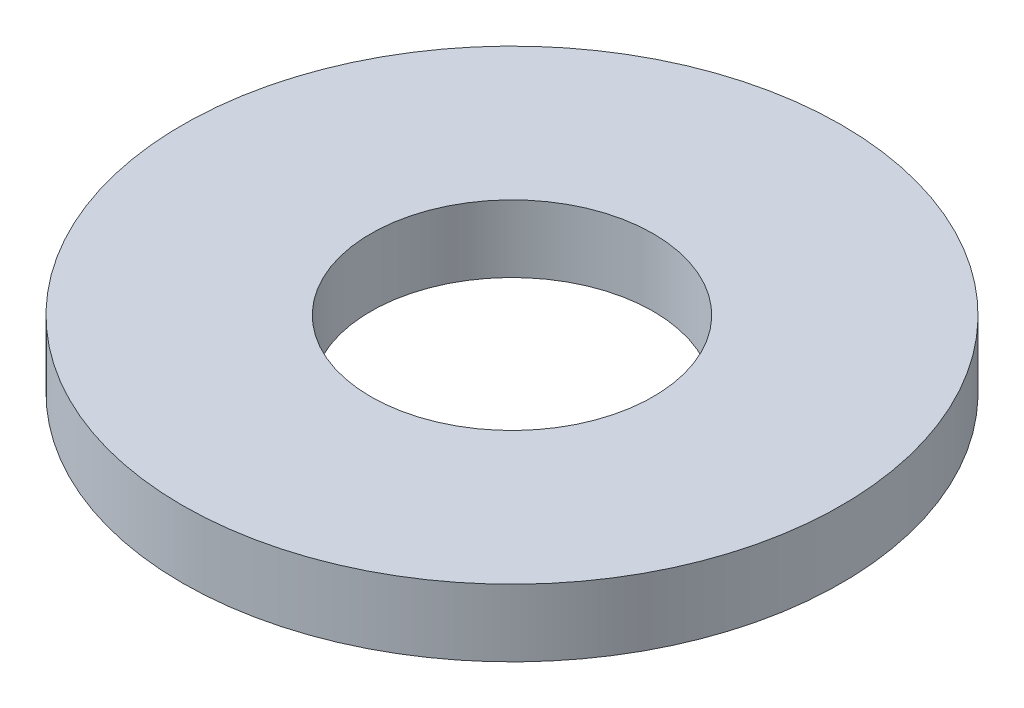
ISO-10303-21;
HEADER;
FILE_DESCRIPTION(('STEP AP214'),'2;1');
FILE_NAME('part.step','',(''),(''),'','','');
FILE_SCHEMA(('AUTOMOTIVE_DESIGN { 1 0 10303 214 1 1 1 1 }'));
ENDSEC;
DATA;
#1=APPLICATION_CONTEXT('core data for automotive mechanical design processes');
#2=APPLICATION_PROTOCOL_DEFINITION('international standard','automotive_design',2000,#1);
#3=PRODUCT_CONTEXT('',#1,'mechanical');
#4=PRODUCT('Part','Part','',(#3));
#5=PRODUCT_RELATED_PRODUCT_CATEGORY('part','',(#4));
#6=PRODUCT_DEFINITION_FORMATION('','',#4);
#7=PRODUCT_DEFINITION_CONTEXT('part definition',#1,'design');
#8=PRODUCT_DEFINITION('design','',#6,#7);
#9=PRODUCT_DEFINITION_SHAPE('','',#8);
#10=(LENGTH_UNIT() NAMED_UNIT(*) SI_UNIT(.MILLI.,.METRE.));
#11=(NAMED_UNIT(*) PLANE_ANGLE_UNIT() SI_UNIT($,.RADIAN.));
#12=(NAMED_UNIT(*) SI_UNIT($,.STERADIAN.) SOLID_ANGLE_UNIT());
#13=UNCERTAINTY_MEASURE_WITH_UNIT(LENGTH_MEASURE(1.E-05),#10,'distance_accuracy_value','');
#14=(GEOMETRIC_REPRESENTATION_CONTEXT(3) GLOBAL_UNCERTAINTY_ASSIGNED_CONTEXT((#13)) GLOBAL_UNIT_ASSIGNED_CONTEXT((#10,
#11,#12)) REPRESENTATION_CONTEXT('',''));
#15=CARTESIAN_POINT('',(0.,0.,0.));
#16=DIRECTION('',(0.,0.,1.));
#17=DIRECTION('',(1.,0.,0.));
#18=AXIS2_PLACEMENT_3D('',#15,#16,#17);
#19=CARTESIAN_POINT('',(0.,0.5,0.));
#20=DIRECTION('',(0.,1.,0.));
#21=DIRECTION('',(0.,0.,1.));
#22=AXIS2_PLACEMENT_3D('',#19,#20,#21);
#23=PLANE('',#22);
#24=CARTESIAN_POINT('',(0.,0.5,0.));
#25=DIRECTION('',(0.,1.,0.));
#26=DIRECTION('',(0.,0.,1.));
#27=AXIS2_PLACEMENT_3D('',#24,#25,#26);
#28=CIRCLE('',#27,2.45);
#29=CARTESIAN_POINT('',(0.,0.5,2.45));
#30=VERTEX_POINT('',#29);
#31=EDGE_CURVE('E10',#30,#30,#28,.T.);
#32=ORIENTED_EDGE('',*,*,#31,.T.);
#33=EDGE_LOOP('',(#32));
#34=FACE_BOUND('',#33,.T.);
#35=CARTESIAN_POINT('',(0.,0.5,0.));
#36=DIRECTION('',(0.,1.,0.));
#37=DIRECTION('',(0.,0.,1.));
#38=AXIS2_PLACEMENT_3D('',#35,#36,#37);
#39=CIRCLE('',#38,1.05);
#40=CARTESIAN_POINT('',(0.,0.5,1.05));
#41=VERTEX_POINT('',#40);
#42=EDGE_CURVE('E44',#41,#41,#39,.T.);
#43=ORIENTED_EDGE('',*,*,#42,.F.);
#44=EDGE_LOOP('',(#43));
#45=FACE_BOUND('',#44,.T.);
#46=ADVANCED_FACE('F33',(#34,#45),#23,.T.);
#47=CARTESIAN_POINT('',(0.,0.,0.));
#48=DIRECTION('',(0.,1.,0.));
#49=DIRECTION('',(0.,0.,1.));
#50=AXIS2_PLACEMENT_3D('',#47,#48,#49);
#51=PLANE('',#50);
#52=CARTESIAN_POINT('',(0.,0.,0.));
#53=DIRECTION('',(0.,1.,0.));
#54=DIRECTION('',(0.,0.,1.));
#55=AXIS2_PLACEMENT_3D('',#52,#53,#54);
#56=CIRCLE('',#55,2.45);
#57=CARTESIAN_POINT('',(0.,0.,2.45));
#58=VERTEX_POINT('',#57);
#59=EDGE_CURVE('E37',#58,#58,#56,.T.);
#60=ORIENTED_EDGE('',*,*,#59,.F.);
#61=EDGE_LOOP('',(#60));
#62=FACE_BOUND('',#61,.T.);
#63=CARTESIAN_POINT('',(0.,0.,0.));
#64=DIRECTION('',(0.,1.,0.));
#65=DIRECTION('',(0.,0.,1.));
#66=AXIS2_PLACEMENT_3D('',#63,#64,#65);
#67=CIRCLE('',#66,1.05);
#68=CARTESIAN_POINT('',(0.,0.,1.05));
#69=VERTEX_POINT('',#68);
#70=EDGE_CURVE('E46',#69,#69,#67,.T.);
#71=ORIENTED_EDGE('',*,*,#70,.T.);
#72=EDGE_LOOP('',(#71));
#73=FACE_BOUND('',#72,.T.);
#74=ADVANCED_FACE('F56',(#62,#73),#51,.F.);
#75=CARTESIAN_POINT('',(0.,0.5,0.));
#76=DIRECTION('',(0.,-1.,0.));
#77=DIRECTION('',(0.,0.,-1.));
#78=AXIS2_PLACEMENT_3D('',#75,#76,#77);
#79=CYLINDRICAL_SURFACE('',#78,2.45);
#80=ORIENTED_EDGE('',*,*,#31,.F.);
#81=EDGE_LOOP('',(#80));
#82=FACE_BOUND('',#81,.T.);
#83=ORIENTED_EDGE('',*,*,#59,.T.);
#84=EDGE_LOOP('',(#83));
#85=FACE_BOUND('',#84,.T.);
#86=ADVANCED_FACE('F35',(#82,#85),#79,.T.);
#87=CARTESIAN_POINT('',(0.,0.5,0.));
#88=DIRECTION('',(0.,-1.,0.));
#89=DIRECTION('',(0.,0.,-1.));
#90=AXIS2_PLACEMENT_3D('',#87,#88,#89);
#91=CYLINDRICAL_SURFACE('',#90,1.05);
#92=ORIENTED_EDGE('',*,*,#42,.T.);
#93=EDGE_LOOP('',(#92));
#94=FACE_BOUND('',#93,.T.);
#95=ORIENTED_EDGE('',*,*,#70,.F.);
#96=EDGE_LOOP('',(#95));
#97=FACE_BOUND('',#96,.T.);
#98=ADVANCED_FACE('F52',(#94,#97),#91,.F.);
#99=CLOSED_SHELL('',(#46,#74,#86,#98));
#100=MANIFOLD_SOLID_BREP('B2',#99);
#101=ADVANCED_BREP_SHAPE_REPRESENTATION('',(#18,#100),#14);
#102=SHAPE_DEFINITION_REPRESENTATION(#9,#101);
ENDSEC;
END-ISO-10303-21;
